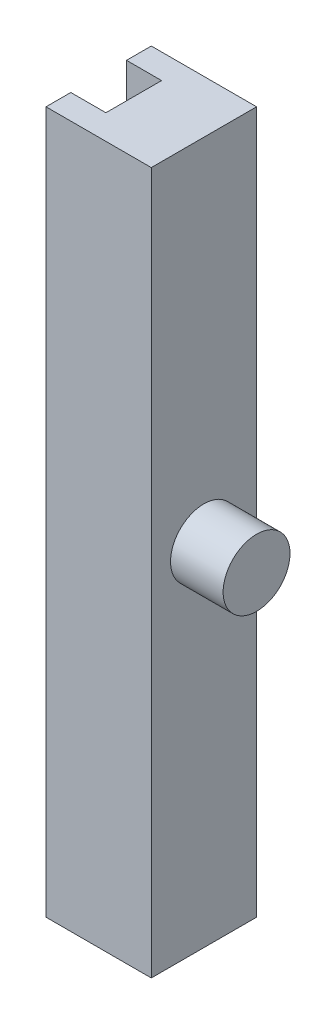
ISO-10303-21;
HEADER;
FILE_DESCRIPTION(('STEP AP214'),'2;1');
FILE_NAME('part.step','',(''),(''),'','','');
FILE_SCHEMA(('AUTOMOTIVE_DESIGN { 1 0 10303 214 1 1 1 1 }'));
ENDSEC;
DATA;
#1=APPLICATION_CONTEXT('core data for automotive mechanical design processes');
#2=APPLICATION_PROTOCOL_DEFINITION('international standard','automotive_design',2000,#1);
#3=PRODUCT_CONTEXT('',#1,'mechanical');
#4=PRODUCT('Part','Part','',(#3));
#5=PRODUCT_RELATED_PRODUCT_CATEGORY('part','',(#4));
#6=PRODUCT_DEFINITION_FORMATION('','',#4);
#7=PRODUCT_DEFINITION_CONTEXT('part definition',#1,'design');
#8=PRODUCT_DEFINITION('design','',#6,#7);
#9=PRODUCT_DEFINITION_SHAPE('','',#8);
#10=(LENGTH_UNIT() NAMED_UNIT(*) SI_UNIT(.MILLI.,.METRE.));
#11=(NAMED_UNIT(*) PLANE_ANGLE_UNIT() SI_UNIT($,.RADIAN.));
#12=(NAMED_UNIT(*) SI_UNIT($,.STERADIAN.) SOLID_ANGLE_UNIT());
#13=UNCERTAINTY_MEASURE_WITH_UNIT(LENGTH_MEASURE(1.E-05),#10,'distance_accuracy_value','');
#14=(GEOMETRIC_REPRESENTATION_CONTEXT(3) GLOBAL_UNCERTAINTY_ASSIGNED_CONTEXT((#13)) GLOBAL_UNIT_ASSIGNED_CONTEXT((#10,
#11,#12)) REPRESENTATION_CONTEXT('',''));
#15=CARTESIAN_POINT('',(0.,0.,0.));
#16=DIRECTION('',(0.,0.,1.));
#17=DIRECTION('',(1.,0.,0.));
#18=AXIS2_PLACEMENT_3D('',#15,#16,#17);
#19=CARTESIAN_POINT('',(0.,-40.,-1.4125));
#20=DIRECTION('',(-1.,0.,0.));
#21=DIRECTION('',(0.,0.,1.));
#22=AXIS2_PLACEMENT_3D('',#19,#20,#21);
#23=PLANE('',#22);
#24=DIRECTION('',(0.,0.,1.));
#25=VECTOR('',#24,1.);
#26=CARTESIAN_POINT('',(0.,0.,-1.4125));
#27=LINE('',#26,#25);
#28=CARTESIAN_POINT('',(0.,0.,-1.4125));
#29=VERTEX_POINT('',#28);
#30=CARTESIAN_POINT('',(0.,0.,0.));
#31=VERTEX_POINT('',#30);
#32=EDGE_CURVE('E131',#29,#31,#27,.T.);
#33=ORIENTED_EDGE('',*,*,#32,.F.);
#34=DIRECTION('',(0.,1.,0.));
#35=VECTOR('',#34,1.);
#36=CARTESIAN_POINT('',(0.,-40.,-1.4125));
#37=LINE('',#36,#35);
#38=CARTESIAN_POINT('',(0.,-40.,-1.4125));
#39=VERTEX_POINT('',#38);
#40=EDGE_CURVE('E11',#39,#29,#37,.T.);
#41=ORIENTED_EDGE('',*,*,#40,.F.);
#42=DIRECTION('',(0.,0.,1.));
#43=VECTOR('',#42,1.);
#44=CARTESIAN_POINT('',(0.,-40.,-1.4125));
#45=LINE('',#44,#43);
#46=CARTESIAN_POINT('',(0.,-40.,0.));
#47=VERTEX_POINT('',#46);
#48=EDGE_CURVE('E152',#39,#47,#45,.T.);
#49=ORIENTED_EDGE('',*,*,#48,.T.);
#50=DIRECTION('',(0.,1.,0.));
#51=VECTOR('',#50,1.);
#52=CARTESIAN_POINT('',(0.,-40.,0.));
#53=LINE('',#52,#51);
#54=EDGE_CURVE('E37',#47,#31,#53,.T.);
#55=ORIENTED_EDGE('',*,*,#54,.T.);
#56=EDGE_LOOP('',(#33,#41,#49,#55));
#57=FACE_BOUND('',#56,.T.);
#58=ADVANCED_FACE('F34',(#57),#23,.T.);
#59=CARTESIAN_POINT('',(2.,-40.,-1.4125));
#60=DIRECTION('',(0.,0.,-1.));
#61=DIRECTION('',(-1.,0.,0.));
#62=AXIS2_PLACEMENT_3D('',#59,#60,#61);
#63=PLANE('',#62);
#64=DIRECTION('',(-1.,0.,0.));
#65=VECTOR('',#64,1.);
#66=CARTESIAN_POINT('',(2.,0.,-1.4125));
#67=LINE('',#66,#65);
#68=CARTESIAN_POINT('',(2.,0.,-1.4125));
#69=VERTEX_POINT('',#68);
#70=EDGE_CURVE('E150',#69,#29,#67,.T.);
#71=ORIENTED_EDGE('',*,*,#70,.F.);
#72=DIRECTION('',(0.,1.,0.));
#73=VECTOR('',#72,1.);
#74=CARTESIAN_POINT('',(2.,-40.,-1.4125));
#75=LINE('',#74,#73);
#76=CARTESIAN_POINT('',(2.,-40.,-1.4125));
#77=VERTEX_POINT('',#76);
#78=EDGE_CURVE('E43',#77,#69,#75,.T.);
#79=ORIENTED_EDGE('',*,*,#78,.F.);
#80=DIRECTION('',(-1.,0.,0.));
#81=VECTOR('',#80,1.);
#82=CARTESIAN_POINT('',(2.,-40.,-1.4125));
#83=LINE('',#82,#81);
#84=EDGE_CURVE('E121',#77,#39,#83,.T.);
#85=ORIENTED_EDGE('',*,*,#84,.T.);
#86=ORIENTED_EDGE('',*,*,#40,.T.);
#87=EDGE_LOOP('',(#71,#79,#85,#86));
#88=FACE_BOUND('',#87,.T.);
#89=ADVANCED_FACE('F164',(#88),#63,.T.);
#90=CARTESIAN_POINT('',(2.,-40.,-4.5875));
#91=DIRECTION('',(-1.,0.,0.));
#92=DIRECTION('',(0.,0.,1.));
#93=AXIS2_PLACEMENT_3D('',#90,#91,#92);
#94=PLANE('',#93);
#95=DIRECTION('',(0.,0.,1.));
#96=VECTOR('',#95,1.);
#97=CARTESIAN_POINT('',(2.,0.,-4.5875));
#98=LINE('',#97,#96);
#99=CARTESIAN_POINT('',(2.,0.,-4.5875));
#100=VERTEX_POINT('',#99);
#101=EDGE_CURVE('E108',#100,#69,#98,.T.);
#102=ORIENTED_EDGE('',*,*,#101,.F.);
#103=DIRECTION('',(0.,1.,0.));
#104=VECTOR('',#103,1.);
#105=CARTESIAN_POINT('',(2.,-40.,-4.5875));
#106=LINE('',#105,#104);
#107=CARTESIAN_POINT('',(2.,-40.,-4.5875));
#108=VERTEX_POINT('',#107);
#109=EDGE_CURVE('E103',#108,#100,#106,.T.);
#110=ORIENTED_EDGE('',*,*,#109,.F.);
#111=DIRECTION('',(0.,0.,1.));
#112=VECTOR('',#111,1.);
#113=CARTESIAN_POINT('',(2.,-40.,-4.5875));
#114=LINE('',#113,#112);
#115=EDGE_CURVE('E106',#108,#77,#114,.T.);
#116=ORIENTED_EDGE('',*,*,#115,.T.);
#117=ORIENTED_EDGE('',*,*,#78,.T.);
#118=EDGE_LOOP('',(#102,#110,#116,#117));
#119=FACE_BOUND('',#118,.T.);
#120=ADVANCED_FACE('F105',(#119),#94,.T.);
#121=CARTESIAN_POINT('',(0.,-40.,-4.5875));
#122=DIRECTION('',(0.,0.,1.));
#123=DIRECTION('',(1.,0.,0.));
#124=AXIS2_PLACEMENT_3D('',#121,#122,#123);
#125=PLANE('',#124);
#126=DIRECTION('',(1.,0.,0.));
#127=VECTOR('',#126,1.);
#128=CARTESIAN_POINT('',(0.,0.,-4.5875));
#129=LINE('',#128,#127);
#130=CARTESIAN_POINT('',(0.,0.,-4.5875));
#131=VERTEX_POINT('',#130);
#132=EDGE_CURVE('E147',#131,#100,#129,.T.);
#133=ORIENTED_EDGE('',*,*,#132,.F.);
#134=DIRECTION('',(0.,1.,0.));
#135=VECTOR('',#134,1.);
#136=CARTESIAN_POINT('',(0.,-40.,-4.5875));
#137=LINE('',#136,#135);
#138=CARTESIAN_POINT('',(0.,-40.,-4.5875));
#139=VERTEX_POINT('',#138);
#140=EDGE_CURVE('E113',#139,#131,#137,.T.);
#141=ORIENTED_EDGE('',*,*,#140,.F.);
#142=DIRECTION('',(1.,0.,0.));
#143=VECTOR('',#142,1.);
#144=CARTESIAN_POINT('',(0.,-40.,-4.5875));
#145=LINE('',#144,#143);
#146=EDGE_CURVE('E119',#139,#108,#145,.T.);
#147=ORIENTED_EDGE('',*,*,#146,.T.);
#148=ORIENTED_EDGE('',*,*,#109,.T.);
#149=EDGE_LOOP('',(#133,#141,#147,#148));
#150=FACE_BOUND('',#149,.T.);
#151=ADVANCED_FACE('F123',(#150),#125,.T.);
#152=CARTESIAN_POINT('',(0.,-40.,-6.));
#153=DIRECTION('',(-1.,0.,0.));
#154=DIRECTION('',(0.,0.,1.));
#155=AXIS2_PLACEMENT_3D('',#152,#153,#154);
#156=PLANE('',#155);
#157=DIRECTION('',(0.,0.,1.));
#158=VECTOR('',#157,1.);
#159=CARTESIAN_POINT('',(0.,0.,-6.));
#160=LINE('',#159,#158);
#161=CARTESIAN_POINT('',(0.,0.,-6.));
#162=VERTEX_POINT('',#161);
#163=EDGE_CURVE('E144',#162,#131,#160,.T.);
#164=ORIENTED_EDGE('',*,*,#163,.F.);
#165=DIRECTION('',(0.,1.,0.));
#166=VECTOR('',#165,1.);
#167=CARTESIAN_POINT('',(0.,-40.,-6.));
#168=LINE('',#167,#166);
#169=CARTESIAN_POINT('',(0.,-40.,-6.));
#170=VERTEX_POINT('',#169);
#171=EDGE_CURVE('E156',#170,#162,#168,.T.);
#172=ORIENTED_EDGE('',*,*,#171,.F.);
#173=DIRECTION('',(0.,0.,1.));
#174=VECTOR('',#173,1.);
#175=CARTESIAN_POINT('',(0.,-40.,-6.));
#176=LINE('',#175,#174);
#177=EDGE_CURVE('E124',#170,#139,#176,.T.);
#178=ORIENTED_EDGE('',*,*,#177,.T.);
#179=ORIENTED_EDGE('',*,*,#140,.T.);
#180=EDGE_LOOP('',(#164,#172,#178,#179));
#181=FACE_BOUND('',#180,.T.);
#182=ADVANCED_FACE('F177',(#181),#156,.T.);
#183=CARTESIAN_POINT('',(6.,-40.,-6.));
#184=DIRECTION('',(0.,0.,-1.));
#185=DIRECTION('',(-1.,0.,0.));
#186=AXIS2_PLACEMENT_3D('',#183,#184,#185);
#187=PLANE('',#186);
#188=DIRECTION('',(-1.,0.,0.));
#189=VECTOR('',#188,1.);
#190=CARTESIAN_POINT('',(6.,0.,-6.));
#191=LINE('',#190,#189);
#192=CARTESIAN_POINT('',(6.,0.,-6.));
#193=VERTEX_POINT('',#192);
#194=EDGE_CURVE('E141',#193,#162,#191,.T.);
#195=ORIENTED_EDGE('',*,*,#194,.F.);
#196=DIRECTION('',(0.,1.,0.));
#197=VECTOR('',#196,1.);
#198=CARTESIAN_POINT('',(6.,-40.,-6.));
#199=LINE('',#198,#197);
#200=CARTESIAN_POINT('',(6.,-40.,-6.));
#201=VERTEX_POINT('',#200);
#202=EDGE_CURVE('E158',#201,#193,#199,.T.);
#203=ORIENTED_EDGE('',*,*,#202,.F.);
#204=DIRECTION('',(-1.,0.,0.));
#205=VECTOR('',#204,1.);
#206=CARTESIAN_POINT('',(6.,-40.,-6.));
#207=LINE('',#206,#205);
#208=EDGE_CURVE('E126',#201,#170,#207,.T.);
#209=ORIENTED_EDGE('',*,*,#208,.T.);
#210=ORIENTED_EDGE('',*,*,#171,.T.);
#211=EDGE_LOOP('',(#195,#203,#209,#210));
#212=FACE_BOUND('',#211,.T.);
#213=ADVANCED_FACE('F180',(#212),#187,.T.);
#214=CARTESIAN_POINT('',(6.,-40.,0.));
#215=DIRECTION('',(1.,0.,0.));
#216=DIRECTION('',(0.,0.,-1.));
#217=AXIS2_PLACEMENT_3D('',#214,#215,#216);
#218=PLANE('',#217);
#219=CARTESIAN_POINT('',(6.,-20.,-3.));
#220=DIRECTION('',(1.,0.,0.));
#221=DIRECTION('',(0.,0.,-1.));
#222=AXIS2_PLACEMENT_3D('',#219,#220,#221);
#223=CIRCLE('',#222,1.905);
#224=CARTESIAN_POINT('',(6.,-20.,-4.905));
#225=VERTEX_POINT('',#224);
#226=EDGE_CURVE('E207',#225,#225,#223,.T.);
#227=ORIENTED_EDGE('',*,*,#226,.F.);
#228=EDGE_LOOP('',(#227));
#229=FACE_BOUND('',#228,.T.);
#230=DIRECTION('',(0.,0.,-1.));
#231=VECTOR('',#230,1.);
#232=CARTESIAN_POINT('',(6.,0.,0.));
#233=LINE('',#232,#231);
#234=CARTESIAN_POINT('',(6.,0.,0.));
#235=VERTEX_POINT('',#234);
#236=EDGE_CURVE('E138',#235,#193,#233,.T.);
#237=ORIENTED_EDGE('',*,*,#236,.F.);
#238=DIRECTION('',(0.,1.,0.));
#239=VECTOR('',#238,1.);
#240=CARTESIAN_POINT('',(6.,-40.,0.));
#241=LINE('',#240,#239);
#242=CARTESIAN_POINT('',(6.,-40.,0.));
#243=VERTEX_POINT('',#242);
#244=EDGE_CURVE('E159',#243,#235,#241,.T.);
#245=ORIENTED_EDGE('',*,*,#244,.F.);
#246=DIRECTION('',(0.,0.,-1.));
#247=VECTOR('',#246,1.);
#248=CARTESIAN_POINT('',(6.,-40.,0.));
#249=LINE('',#248,#247);
#250=EDGE_CURVE('E215',#243,#201,#249,.T.);
#251=ORIENTED_EDGE('',*,*,#250,.T.);
#252=ORIENTED_EDGE('',*,*,#202,.T.);
#253=EDGE_LOOP('',(#237,#245,#251,#252));
#254=FACE_BOUND('',#253,.T.);
#255=ADVANCED_FACE('F184',(#229,#254),#218,.T.);
#256=CARTESIAN_POINT('',(0.,-40.,0.));
#257=DIRECTION('',(0.,0.,1.));
#258=DIRECTION('',(1.,0.,0.));
#259=AXIS2_PLACEMENT_3D('',#256,#257,#258);
#260=PLANE('',#259);
#261=DIRECTION('',(1.,0.,0.));
#262=VECTOR('',#261,1.);
#263=CARTESIAN_POINT('',(0.,0.,0.));
#264=LINE('',#263,#262);
#265=EDGE_CURVE('E134',#31,#235,#264,.T.);
#266=ORIENTED_EDGE('',*,*,#265,.F.);
#267=ORIENTED_EDGE('',*,*,#54,.F.);
#268=DIRECTION('',(1.,0.,0.));
#269=VECTOR('',#268,1.);
#270=CARTESIAN_POINT('',(0.,-40.,0.));
#271=LINE('',#270,#269);
#272=EDGE_CURVE('E213',#47,#243,#271,.T.);
#273=ORIENTED_EDGE('',*,*,#272,.T.);
#274=ORIENTED_EDGE('',*,*,#244,.T.);
#275=EDGE_LOOP('',(#266,#267,#273,#274));
#276=FACE_BOUND('',#275,.T.);
#277=ADVANCED_FACE('F161',(#276),#260,.T.);
#278=CARTESIAN_POINT('',(0.,-40.,0.));
#279=DIRECTION('',(0.,1.,0.));
#280=DIRECTION('',(0.,0.,1.));
#281=AXIS2_PLACEMENT_3D('',#278,#279,#280);
#282=PLANE('',#281);
#283=ORIENTED_EDGE('',*,*,#48,.F.);
#284=ORIENTED_EDGE('',*,*,#84,.F.);
#285=ORIENTED_EDGE('',*,*,#115,.F.);
#286=ORIENTED_EDGE('',*,*,#146,.F.);
#287=ORIENTED_EDGE('',*,*,#177,.F.);
#288=ORIENTED_EDGE('',*,*,#208,.F.);
#289=ORIENTED_EDGE('',*,*,#250,.F.);
#290=ORIENTED_EDGE('',*,*,#272,.F.);
#291=EDGE_LOOP('',(#283,#284,#285,#286,#287,#288,#289,#290));
#292=FACE_BOUND('',#291,.T.);
#293=ADVANCED_FACE('F117',(#292),#282,.F.);
#294=CARTESIAN_POINT('',(0.,0.,0.));
#295=DIRECTION('',(0.,1.,0.));
#296=DIRECTION('',(0.,0.,1.));
#297=AXIS2_PLACEMENT_3D('',#294,#295,#296);
#298=PLANE('',#297);
#299=ORIENTED_EDGE('',*,*,#32,.T.);
#300=ORIENTED_EDGE('',*,*,#265,.T.);
#301=ORIENTED_EDGE('',*,*,#236,.T.);
#302=ORIENTED_EDGE('',*,*,#194,.T.);
#303=ORIENTED_EDGE('',*,*,#163,.T.);
#304=ORIENTED_EDGE('',*,*,#132,.T.);
#305=ORIENTED_EDGE('',*,*,#101,.T.);
#306=ORIENTED_EDGE('',*,*,#70,.T.);
#307=EDGE_LOOP('',(#299,#300,#301,#302,#303,#304,#305,#306));
#308=FACE_BOUND('',#307,.T.);
#309=ADVANCED_FACE('F163',(#308),#298,.T.);
#310=CARTESIAN_POINT('',(9.,-20.,-3.));
#311=DIRECTION('',(-1.,0.,0.));
#312=DIRECTION('',(0.,0.,1.));
#313=AXIS2_PLACEMENT_3D('',#310,#311,#312);
#314=CYLINDRICAL_SURFACE('',#313,1.905);
#315=CARTESIAN_POINT('',(9.,-20.,-3.));
#316=DIRECTION('',(1.,0.,0.));
#317=DIRECTION('',(0.,0.,-1.));
#318=AXIS2_PLACEMENT_3D('',#315,#316,#317);
#319=CIRCLE('',#318,1.905);
#320=CARTESIAN_POINT('',(9.,-20.,-4.905));
#321=VERTEX_POINT('',#320);
#322=EDGE_CURVE('E135',#321,#321,#319,.T.);
#323=ORIENTED_EDGE('',*,*,#322,.F.);
#324=EDGE_LOOP('',(#323));
#325=FACE_BOUND('',#324,.T.);
#326=ORIENTED_EDGE('',*,*,#226,.T.);
#327=EDGE_LOOP('',(#326));
#328=FACE_BOUND('',#327,.T.);
#329=ADVANCED_FACE('F195',(#325,#328),#314,.T.);
#330=CARTESIAN_POINT('',(9.,-20.,-3.));
#331=DIRECTION('',(1.,0.,0.));
#332=DIRECTION('',(0.,0.,-1.));
#333=AXIS2_PLACEMENT_3D('',#330,#331,#332);
#334=PLANE('',#333);
#335=ORIENTED_EDGE('',*,*,#322,.T.);
#336=EDGE_LOOP('',(#335));
#337=FACE_BOUND('',#336,.T.);
#338=ADVANCED_FACE('F199',(#337),#334,.T.);
#339=CLOSED_SHELL('',(#58,#89,#120,#151,#182,#213,#255,#277,#293,#309,#329,#338));
#340=MANIFOLD_SOLID_BREP('B2',#339);
#341=ADVANCED_BREP_SHAPE_REPRESENTATION('',(#18,#340),#14);
#342=SHAPE_DEFINITION_REPRESENTATION(#9,#341);
ENDSEC;
END-ISO-10303-21;
